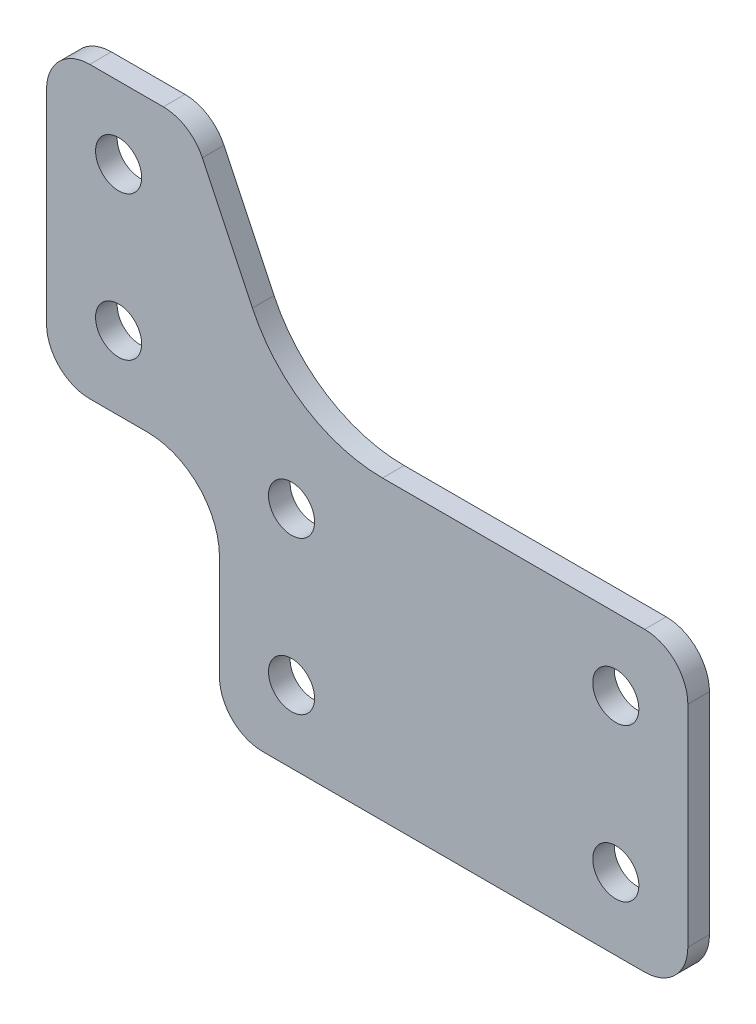
ISO-10303-21;
HEADER;
FILE_DESCRIPTION(('STEP AP214'),'2;1');
FILE_NAME('part.step','',(''),(''),'','','');
FILE_SCHEMA(('AUTOMOTIVE_DESIGN { 1 0 10303 214 1 1 1 1 }'));
ENDSEC;
DATA;
#1=APPLICATION_CONTEXT('core data for automotive mechanical design processes');
#2=APPLICATION_PROTOCOL_DEFINITION('international standard','automotive_design',2000,#1);
#3=PRODUCT_CONTEXT('',#1,'mechanical');
#4=PRODUCT('Part','Part','',(#3));
#5=PRODUCT_RELATED_PRODUCT_CATEGORY('part','',(#4));
#6=PRODUCT_DEFINITION_FORMATION('','',#4);
#7=PRODUCT_DEFINITION_CONTEXT('part definition',#1,'design');
#8=PRODUCT_DEFINITION('design','',#6,#7);
#9=PRODUCT_DEFINITION_SHAPE('','',#8);
#10=(LENGTH_UNIT() NAMED_UNIT(*) SI_UNIT(.MILLI.,.METRE.));
#11=(NAMED_UNIT(*) PLANE_ANGLE_UNIT() SI_UNIT($,.RADIAN.));
#12=(NAMED_UNIT(*) SI_UNIT($,.STERADIAN.) SOLID_ANGLE_UNIT());
#13=UNCERTAINTY_MEASURE_WITH_UNIT(LENGTH_MEASURE(1.E-05),#10,'distance_accuracy_value','');
#14=(GEOMETRIC_REPRESENTATION_CONTEXT(3) GLOBAL_UNCERTAINTY_ASSIGNED_CONTEXT((#13)) GLOBAL_UNIT_ASSIGNED_CONTEXT((#10,
#11,#12)) REPRESENTATION_CONTEXT('',''));
#15=CARTESIAN_POINT('',(0.,0.,0.));
#16=DIRECTION('',(0.,0.,1.));
#17=DIRECTION('',(1.,0.,0.));
#18=AXIS2_PLACEMENT_3D('',#15,#16,#17);
#19=CARTESIAN_POINT('',(0.,4.90000000000024,1.5));
#20=DIRECTION('',(0.,1.,0.));
#21=DIRECTION('',(-1.,0.,0.));
#22=AXIS2_PLACEMENT_3D('',#19,#20,#21);
#23=PLANE('',#22);
#24=DIRECTION('',(1.,0.,0.));
#25=VECTOR('',#24,1.);
#26=CARTESIAN_POINT('',(0.,4.90000000000024,0.));
#27=LINE('',#26,#25);
#28=CARTESIAN_POINT('',(-25.25,4.89999999999998,0.));
#29=VERTEX_POINT('',#28);
#30=CARTESIAN_POINT('',(-21.25,4.90000000000002,0.));
#31=VERTEX_POINT('',#30);
#32=EDGE_CURVE('E306',#29,#31,#27,.T.);
#33=ORIENTED_EDGE('',*,*,#32,.T.);
#34=DIRECTION('',(0.,0.,-1.));
#35=VECTOR('',#34,1.);
#36=CARTESIAN_POINT('',(-21.25,4.90000000000002,1.5));
#37=LINE('',#36,#35);
#38=CARTESIAN_POINT('',(-21.25,4.90000000000002,1.5));
#39=VERTEX_POINT('',#38);
#40=EDGE_CURVE('E253',#31,#39,#37,.F.);
#41=ORIENTED_EDGE('',*,*,#40,.T.);
#42=DIRECTION('',(1.,0.,0.));
#43=VECTOR('',#42,1.);
#44=CARTESIAN_POINT('',(0.,4.90000000000024,1.5));
#45=LINE('',#44,#43);
#46=CARTESIAN_POINT('',(-25.25,4.89999999999998,1.5));
#47=VERTEX_POINT('',#46);
#48=EDGE_CURVE('E201',#47,#39,#45,.T.);
#49=ORIENTED_EDGE('',*,*,#48,.F.);
#50=DIRECTION('',(0.,0.,-1.));
#51=VECTOR('',#50,1.);
#52=CARTESIAN_POINT('',(-25.25,4.89999999999998,1.5));
#53=LINE('',#52,#51);
#54=EDGE_CURVE('E226',#47,#29,#53,.T.);
#55=ORIENTED_EDGE('',*,*,#54,.T.);
#56=EDGE_LOOP('',(#33,#41,#49,#55));
#57=FACE_BOUND('',#56,.T.);
#58=ADVANCED_FACE('F37',(#57),#23,.F.);
#59=CARTESIAN_POINT('',(-16.25,0.,1.5));
#60=DIRECTION('',(1.,0.,0.));
#61=DIRECTION('',(0.,0.,-1.));
#62=AXIS2_PLACEMENT_3D('',#59,#60,#61);
#63=PLANE('',#62);
#64=DIRECTION('',(0.,-1.,0.));
#65=VECTOR('',#64,1.);
#66=CARTESIAN_POINT('',(-16.25,0.,1.5));
#67=LINE('',#66,#65);
#68=CARTESIAN_POINT('',(-16.25,-0.0999999999999785,1.5));
#69=VERTEX_POINT('',#68);
#70=CARTESIAN_POINT('',(-16.25,-7.3,1.5));
#71=VERTEX_POINT('',#70);
#72=EDGE_CURVE('E367',#69,#71,#67,.T.);
#73=ORIENTED_EDGE('',*,*,#72,.F.);
#74=DIRECTION('',(0.,0.,-1.));
#75=VECTOR('',#74,1.);
#76=CARTESIAN_POINT('',(-16.25,-0.0999999999999785,0.));
#77=LINE('',#76,#75);
#78=CARTESIAN_POINT('',(-16.25,-0.0999999999999785,0.));
#79=VERTEX_POINT('',#78);
#80=EDGE_CURVE('E250',#69,#79,#77,.T.);
#81=ORIENTED_EDGE('',*,*,#80,.T.);
#82=DIRECTION('',(0.,-1.,0.));
#83=VECTOR('',#82,1.);
#84=CARTESIAN_POINT('',(-16.25,0.,0.));
#85=LINE('',#84,#83);
#86=CARTESIAN_POINT('',(-16.25,-7.3,0.));
#87=VERTEX_POINT('',#86);
#88=EDGE_CURVE('E309',#79,#87,#85,.T.);
#89=ORIENTED_EDGE('',*,*,#88,.T.);
#90=DIRECTION('',(0.,0.,-1.));
#91=VECTOR('',#90,1.);
#92=CARTESIAN_POINT('',(-16.25,-7.3,1.5));
#93=LINE('',#92,#91);
#94=EDGE_CURVE('E239',#87,#71,#93,.F.);
#95=ORIENTED_EDGE('',*,*,#94,.T.);
#96=EDGE_LOOP('',(#73,#81,#89,#95));
#97=FACE_BOUND('',#96,.T.);
#98=ADVANCED_FACE('F339',(#97),#63,.F.);
#99=CARTESIAN_POINT('',(0.,-10.3,1.5));
#100=DIRECTION('',(0.,-1.,0.));
#101=DIRECTION('',(0.,0.,-1.));
#102=AXIS2_PLACEMENT_3D('',#99,#100,#101);
#103=PLANE('',#102);
#104=DIRECTION('',(-1.,0.,0.));
#105=VECTOR('',#104,1.);
#106=CARTESIAN_POINT('',(0.,-10.3,1.5));
#107=LINE('',#106,#105);
#108=CARTESIAN_POINT('',(13.25,-10.3,1.5));
#109=VERTEX_POINT('',#108);
#110=CARTESIAN_POINT('',(-13.25,-10.3,1.5));
#111=VERTEX_POINT('',#110);
#112=EDGE_CURVE('E281',#109,#111,#107,.T.);
#113=ORIENTED_EDGE('',*,*,#112,.T.);
#114=DIRECTION('',(0.,0.,-1.));
#115=VECTOR('',#114,1.);
#116=CARTESIAN_POINT('',(-13.25,-10.3,0.));
#117=LINE('',#116,#115);
#118=CARTESIAN_POINT('',(-13.25,-10.3,0.));
#119=VERTEX_POINT('',#118);
#120=EDGE_CURVE('E236',#111,#119,#117,.T.);
#121=ORIENTED_EDGE('',*,*,#120,.T.);
#122=DIRECTION('',(-1.,0.,0.));
#123=VECTOR('',#122,1.);
#124=CARTESIAN_POINT('',(0.,-10.3,0.));
#125=LINE('',#124,#123);
#126=CARTESIAN_POINT('',(13.25,-10.3,0.));
#127=VERTEX_POINT('',#126);
#128=EDGE_CURVE('E311',#127,#119,#125,.T.);
#129=ORIENTED_EDGE('',*,*,#128,.F.);
#130=DIRECTION('',(0.,0.,-1.));
#131=VECTOR('',#130,1.);
#132=CARTESIAN_POINT('',(13.25,-10.3,1.5));
#133=LINE('',#132,#131);
#134=EDGE_CURVE('E234',#127,#109,#133,.F.);
#135=ORIENTED_EDGE('',*,*,#134,.T.);
#136=EDGE_LOOP('',(#113,#121,#129,#135));
#137=FACE_BOUND('',#136,.T.);
#138=ADVANCED_FACE('F345',(#137),#103,.T.);
#139=CARTESIAN_POINT('',(16.25,0.,1.5));
#140=DIRECTION('',(1.,0.,0.));
#141=DIRECTION('',(0.,0.,-1.));
#142=AXIS2_PLACEMENT_3D('',#139,#140,#141);
#143=PLANE('',#142);
#144=DIRECTION('',(0.,-1.,0.));
#145=VECTOR('',#144,1.);
#146=CARTESIAN_POINT('',(16.25,0.,1.5));
#147=LINE('',#146,#145);
#148=CARTESIAN_POINT('',(16.25,7.3,1.5));
#149=VERTEX_POINT('',#148);
#150=CARTESIAN_POINT('',(16.25,-7.3,1.5));
#151=VERTEX_POINT('',#150);
#152=EDGE_CURVE('E277',#149,#151,#147,.T.);
#153=ORIENTED_EDGE('',*,*,#152,.T.);
#154=DIRECTION('',(0.,0.,-1.));
#155=VECTOR('',#154,1.);
#156=CARTESIAN_POINT('',(16.25,-7.3,1.5));
#157=LINE('',#156,#155);
#158=CARTESIAN_POINT('',(16.25,-7.3,0.));
#159=VERTEX_POINT('',#158);
#160=EDGE_CURVE('E244',#151,#159,#157,.T.);
#161=ORIENTED_EDGE('',*,*,#160,.T.);
#162=DIRECTION('',(0.,-1.,0.));
#163=VECTOR('',#162,1.);
#164=CARTESIAN_POINT('',(16.25,0.,0.));
#165=LINE('',#164,#163);
#166=CARTESIAN_POINT('',(16.25,7.3,0.));
#167=VERTEX_POINT('',#166);
#168=EDGE_CURVE('E314',#167,#159,#165,.T.);
#169=ORIENTED_EDGE('',*,*,#168,.F.);
#170=DIRECTION('',(0.,0.,-1.));
#171=VECTOR('',#170,1.);
#172=CARTESIAN_POINT('',(16.25,7.3,1.5));
#173=LINE('',#172,#171);
#174=EDGE_CURVE('E242',#167,#149,#173,.F.);
#175=ORIENTED_EDGE('',*,*,#174,.T.);
#176=EDGE_LOOP('',(#153,#161,#169,#175));
#177=FACE_BOUND('',#176,.T.);
#178=ADVANCED_FACE('F321',(#177),#143,.T.);
#179=CARTESIAN_POINT('',(0.,10.3,1.5));
#180=DIRECTION('',(0.,-1.,0.));
#181=DIRECTION('',(0.,0.,-1.));
#182=AXIS2_PLACEMENT_3D('',#179,#180,#181);
#183=PLANE('',#182);
#184=DIRECTION('',(-1.,0.,0.));
#185=VECTOR('',#184,1.);
#186=CARTESIAN_POINT('',(0.,10.3,0.));
#187=LINE('',#186,#185);
#188=CARTESIAN_POINT('',(13.25,10.3,0.));
#189=VERTEX_POINT('',#188);
#190=CARTESIAN_POINT('',(-4.93599680989238,10.3,0.));
#191=VERTEX_POINT('',#190);
#192=EDGE_CURVE('E180',#189,#191,#187,.T.);
#193=ORIENTED_EDGE('',*,*,#192,.T.);
#194=DIRECTION('',(0.,0.,-1.));
#195=VECTOR('',#194,1.);
#196=CARTESIAN_POINT('',(-4.93599680989238,10.3,1.5));
#197=LINE('',#196,#195);
#198=CARTESIAN_POINT('',(-4.93599680989238,10.3,1.5));
#199=VERTEX_POINT('',#198);
#200=EDGE_CURVE('E58',#191,#199,#197,.F.);
#201=ORIENTED_EDGE('',*,*,#200,.T.);
#202=DIRECTION('',(-1.,0.,0.));
#203=VECTOR('',#202,1.);
#204=CARTESIAN_POINT('',(0.,10.3,1.5));
#205=LINE('',#204,#203);
#206=CARTESIAN_POINT('',(13.25,10.3,1.5));
#207=VERTEX_POINT('',#206);
#208=EDGE_CURVE('E273',#207,#199,#205,.T.);
#209=ORIENTED_EDGE('',*,*,#208,.F.);
#210=DIRECTION('',(0.,0.,-1.));
#211=VECTOR('',#210,1.);
#212=CARTESIAN_POINT('',(13.25,10.3,0.));
#213=LINE('',#212,#211);
#214=EDGE_CURVE('E247',#207,#189,#213,.T.);
#215=ORIENTED_EDGE('',*,*,#214,.T.);
#216=EDGE_LOOP('',(#193,#201,#209,#215));
#217=FACE_BOUND('',#216,.T.);
#218=ADVANCED_FACE('F316',(#217),#183,.F.);
#219=CARTESIAN_POINT('',(-5.1723659889094,-2.4630314232902,1.5));
#220=DIRECTION('',(0.90286051882393,0.429933580392349,0.));
#221=DIRECTION('',(-0.429933580392349,0.90286051882393,0.));
#222=AXIS2_PLACEMENT_3D('',#219,#220,#221);
#223=PLANE('',#222);
#224=DIRECTION('',(0.429933580392349,-0.90286051882393,0.));
#225=VECTOR('',#224,1.);
#226=CARTESIAN_POINT('',(-5.1723659889094,-2.4630314232902,1.5));
#227=LINE('',#226,#225);
#228=CARTESIAN_POINT('',(-17.4356194005605,23.2898007411771,1.5));
#229=VERTEX_POINT('',#228);
#230=CARTESIAN_POINT('',(-13.9646019981317,16.0006641960765,1.5));
#231=VERTEX_POINT('',#230);
#232=EDGE_CURVE('E267',#229,#231,#227,.T.);
#233=ORIENTED_EDGE('',*,*,#232,.T.);
#234=DIRECTION('',(0.,0.,-1.));
#235=VECTOR('',#234,1.);
#236=CARTESIAN_POINT('',(-13.9646019981317,16.0006641960765,1.5));
#237=LINE('',#236,#235);
#238=CARTESIAN_POINT('',(-13.9646019981317,16.0006641960765,0.));
#239=VERTEX_POINT('',#238);
#240=EDGE_CURVE('E259',#231,#239,#237,.T.);
#241=ORIENTED_EDGE('',*,*,#240,.T.);
#242=DIRECTION('',(0.429933580392349,-0.90286051882393,0.));
#243=VECTOR('',#242,1.);
#244=CARTESIAN_POINT('',(-5.1723659889094,-2.4630314232902,0.));
#245=LINE('',#244,#243);
#246=CARTESIAN_POINT('',(-17.4356194005605,23.2898007411771,0.));
#247=VERTEX_POINT('',#246);
#248=EDGE_CURVE('E175',#247,#239,#245,.T.);
#249=ORIENTED_EDGE('',*,*,#248,.F.);
#250=DIRECTION('',(0.,0.,-1.));
#251=VECTOR('',#250,1.);
#252=CARTESIAN_POINT('',(-17.4356194005605,23.2898007411771,1.5));
#253=LINE('',#252,#251);
#254=EDGE_CURVE('E155',#247,#229,#253,.F.);
#255=ORIENTED_EDGE('',*,*,#254,.T.);
#256=EDGE_LOOP('',(#233,#241,#249,#255));
#257=FACE_BOUND('',#256,.T.);
#258=ADVANCED_FACE('F265',(#257),#223,.T.);
#259=CARTESIAN_POINT('',(0.,25.,1.5));
#260=DIRECTION('',(0.,-1.,0.));
#261=DIRECTION('',(0.,0.,-1.));
#262=AXIS2_PLACEMENT_3D('',#259,#260,#261);
#263=PLANE('',#262);
#264=DIRECTION('',(-1.,0.,0.));
#265=VECTOR('',#264,1.);
#266=CARTESIAN_POINT('',(0.,25.,1.5));
#267=LINE('',#266,#265);
#268=CARTESIAN_POINT('',(-20.1442009570323,25.,1.5));
#269=VERTEX_POINT('',#268);
#270=CARTESIAN_POINT('',(-25.25,25.,1.5));
#271=VERTEX_POINT('',#270);
#272=EDGE_CURVE('E167',#269,#271,#267,.T.);
#273=ORIENTED_EDGE('',*,*,#272,.F.);
#274=DIRECTION('',(0.,0.,-1.));
#275=VECTOR('',#274,1.);
#276=CARTESIAN_POINT('',(-20.1442009570323,25.,0.));
#277=LINE('',#276,#275);
#278=CARTESIAN_POINT('',(-20.1442009570323,25.,0.));
#279=VERTEX_POINT('',#278);
#280=EDGE_CURVE('E154',#269,#279,#277,.T.);
#281=ORIENTED_EDGE('',*,*,#280,.T.);
#282=DIRECTION('',(-1.,0.,0.));
#283=VECTOR('',#282,1.);
#284=CARTESIAN_POINT('',(0.,25.,0.));
#285=LINE('',#284,#283);
#286=CARTESIAN_POINT('',(-25.25,25.,0.));
#287=VERTEX_POINT('',#286);
#288=EDGE_CURVE('E164',#279,#287,#285,.T.);
#289=ORIENTED_EDGE('',*,*,#288,.T.);
#290=DIRECTION('',(0.,0.,-1.));
#291=VECTOR('',#290,1.);
#292=CARTESIAN_POINT('',(-25.25,25.,1.5));
#293=LINE('',#292,#291);
#294=EDGE_CURVE('E169',#287,#271,#293,.F.);
#295=ORIENTED_EDGE('',*,*,#294,.T.);
#296=EDGE_LOOP('',(#273,#281,#289,#295));
#297=FACE_BOUND('',#296,.T.);
#298=ADVANCED_FACE('F163',(#297),#263,.F.);
#299=CARTESIAN_POINT('',(-11.25,5.3,1.5));
#300=DIRECTION('',(0.,0.,-1.));
#301=DIRECTION('',(-1.,0.,0.));
#302=AXIS2_PLACEMENT_3D('',#299,#300,#301);
#303=CYLINDRICAL_SURFACE('',#302,1.6);
#304=CARTESIAN_POINT('',(-11.25,5.3,1.5));
#305=DIRECTION('',(0.,0.,1.));
#306=DIRECTION('',(1.,0.,0.));
#307=AXIS2_PLACEMENT_3D('',#304,#305,#306);
#308=CIRCLE('',#307,1.6);
#309=CARTESIAN_POINT('',(-9.64999999999999,5.3,1.5));
#310=VERTEX_POINT('',#309);
#311=EDGE_CURVE('E301',#310,#310,#308,.T.);
#312=ORIENTED_EDGE('',*,*,#311,.T.);
#313=EDGE_LOOP('',(#312));
#314=FACE_BOUND('',#313,.T.);
#315=CARTESIAN_POINT('',(-11.25,5.3,0.));
#316=DIRECTION('',(0.,0.,1.));
#317=DIRECTION('',(1.,0.,0.));
#318=AXIS2_PLACEMENT_3D('',#315,#316,#317);
#319=CIRCLE('',#318,1.6);
#320=CARTESIAN_POINT('',(-9.64999999999999,5.3,0.));
#321=VERTEX_POINT('',#320);
#322=EDGE_CURVE('E195',#321,#321,#319,.T.);
#323=ORIENTED_EDGE('',*,*,#322,.F.);
#324=EDGE_LOOP('',(#323));
#325=FACE_BOUND('',#324,.T.);
#326=ADVANCED_FACE('F406',(#314,#325),#303,.F.);
#327=CARTESIAN_POINT('',(-11.25,-5.3,1.5));
#328=DIRECTION('',(0.,0.,-1.));
#329=DIRECTION('',(-1.,0.,0.));
#330=AXIS2_PLACEMENT_3D('',#327,#328,#329);
#331=CYLINDRICAL_SURFACE('',#330,1.6);
#332=CARTESIAN_POINT('',(-11.25,-5.3,1.5));
#333=DIRECTION('',(0.,0.,1.));
#334=DIRECTION('',(1.,0.,0.));
#335=AXIS2_PLACEMENT_3D('',#332,#333,#334);
#336=CIRCLE('',#335,1.6);
#337=CARTESIAN_POINT('',(-9.64999999999999,-5.3,1.5));
#338=VERTEX_POINT('',#337);
#339=EDGE_CURVE('E298',#338,#338,#336,.T.);
#340=ORIENTED_EDGE('',*,*,#339,.T.);
#341=EDGE_LOOP('',(#340));
#342=FACE_BOUND('',#341,.T.);
#343=CARTESIAN_POINT('',(-11.25,-5.3,0.));
#344=DIRECTION('',(0.,0.,1.));
#345=DIRECTION('',(1.,0.,0.));
#346=AXIS2_PLACEMENT_3D('',#343,#344,#345);
#347=CIRCLE('',#346,1.6);
#348=CARTESIAN_POINT('',(-9.64999999999999,-5.3,0.));
#349=VERTEX_POINT('',#348);
#350=EDGE_CURVE('E192',#349,#349,#347,.T.);
#351=ORIENTED_EDGE('',*,*,#350,.F.);
#352=EDGE_LOOP('',(#351));
#353=FACE_BOUND('',#352,.T.);
#354=ADVANCED_FACE('F442',(#342,#353),#331,.F.);
#355=CARTESIAN_POINT('',(11.25,-5.3,1.5));
#356=DIRECTION('',(0.,0.,-1.));
#357=DIRECTION('',(-1.,0.,0.));
#358=AXIS2_PLACEMENT_3D('',#355,#356,#357);
#359=CYLINDRICAL_SURFACE('',#358,1.6);
#360=CARTESIAN_POINT('',(11.25,-5.3,1.5));
#361=DIRECTION('',(0.,0.,1.));
#362=DIRECTION('',(1.,0.,0.));
#363=AXIS2_PLACEMENT_3D('',#360,#361,#362);
#364=CIRCLE('',#363,1.6);
#365=CARTESIAN_POINT('',(12.85,-5.3,1.5));
#366=VERTEX_POINT('',#365);
#367=EDGE_CURVE('E295',#366,#366,#364,.F.);
#368=ORIENTED_EDGE('',*,*,#367,.F.);
#369=EDGE_LOOP('',(#368));
#370=FACE_BOUND('',#369,.T.);
#371=CARTESIAN_POINT('',(11.25,-5.3,0.));
#372=DIRECTION('',(0.,0.,1.));
#373=DIRECTION('',(1.,0.,0.));
#374=AXIS2_PLACEMENT_3D('',#371,#372,#373);
#375=CIRCLE('',#374,1.6);
#376=CARTESIAN_POINT('',(12.85,-5.3,0.));
#377=VERTEX_POINT('',#376);
#378=EDGE_CURVE('E189',#377,#377,#375,.F.);
#379=ORIENTED_EDGE('',*,*,#378,.T.);
#380=EDGE_LOOP('',(#379));
#381=FACE_BOUND('',#380,.T.);
#382=ADVANCED_FACE('F450',(#370,#381),#359,.F.);
#383=CARTESIAN_POINT('',(-23.25,20.,1.5));
#384=DIRECTION('',(0.,0.,-1.));
#385=DIRECTION('',(-1.,0.,0.));
#386=AXIS2_PLACEMENT_3D('',#383,#384,#385);
#387=CYLINDRICAL_SURFACE('',#386,1.6);
#388=CARTESIAN_POINT('',(-23.25,20.,1.5));
#389=DIRECTION('',(0.,0.,1.));
#390=DIRECTION('',(1.,0.,0.));
#391=AXIS2_PLACEMENT_3D('',#388,#389,#390);
#392=CIRCLE('',#391,1.6);
#393=CARTESIAN_POINT('',(-21.65,20.,1.5));
#394=VERTEX_POINT('',#393);
#395=EDGE_CURVE('E292',#394,#394,#392,.T.);
#396=ORIENTED_EDGE('',*,*,#395,.T.);
#397=EDGE_LOOP('',(#396));
#398=FACE_BOUND('',#397,.T.);
#399=CARTESIAN_POINT('',(-23.25,20.,0.));
#400=DIRECTION('',(0.,0.,1.));
#401=DIRECTION('',(1.,0.,0.));
#402=AXIS2_PLACEMENT_3D('',#399,#400,#401);
#403=CIRCLE('',#402,1.6);
#404=CARTESIAN_POINT('',(-21.65,20.,0.));
#405=VERTEX_POINT('',#404);
#406=EDGE_CURVE('E186',#405,#405,#403,.T.);
#407=ORIENTED_EDGE('',*,*,#406,.F.);
#408=EDGE_LOOP('',(#407));
#409=FACE_BOUND('',#408,.T.);
#410=ADVANCED_FACE('F399',(#398,#409),#387,.F.);
#411=CARTESIAN_POINT('',(-23.25,10.,1.5));
#412=DIRECTION('',(0.,0.,-1.));
#413=DIRECTION('',(-1.,0.,0.));
#414=AXIS2_PLACEMENT_3D('',#411,#412,#413);
#415=CYLINDRICAL_SURFACE('',#414,1.6);
#416=CARTESIAN_POINT('',(-23.25,10.,1.5));
#417=DIRECTION('',(0.,0.,1.));
#418=DIRECTION('',(1.,0.,0.));
#419=AXIS2_PLACEMENT_3D('',#416,#417,#418);
#420=CIRCLE('',#419,1.6);
#421=CARTESIAN_POINT('',(-21.65,10.,1.5));
#422=VERTEX_POINT('',#421);
#423=EDGE_CURVE('E289',#422,#422,#420,.T.);
#424=ORIENTED_EDGE('',*,*,#423,.T.);
#425=EDGE_LOOP('',(#424));
#426=FACE_BOUND('',#425,.T.);
#427=CARTESIAN_POINT('',(-23.25,10.,0.));
#428=DIRECTION('',(0.,0.,1.));
#429=DIRECTION('',(1.,0.,0.));
#430=AXIS2_PLACEMENT_3D('',#427,#428,#429);
#431=CIRCLE('',#430,1.6);
#432=CARTESIAN_POINT('',(-21.65,10.,0.));
#433=VERTEX_POINT('',#432);
#434=EDGE_CURVE('E178',#433,#433,#431,.T.);
#435=ORIENTED_EDGE('',*,*,#434,.F.);
#436=EDGE_LOOP('',(#435));
#437=FACE_BOUND('',#436,.T.);
#438=ADVANCED_FACE('F391',(#426,#437),#415,.F.);
#439=CARTESIAN_POINT('',(-28.25,0.,1.5));
#440=DIRECTION('',(1.,0.,0.));
#441=DIRECTION('',(0.,0.,-1.));
#442=AXIS2_PLACEMENT_3D('',#439,#440,#441);
#443=PLANE('',#442);
#444=DIRECTION('',(0.,-1.,0.));
#445=VECTOR('',#444,1.);
#446=CARTESIAN_POINT('',(-28.25,0.,0.));
#447=LINE('',#446,#445);
#448=CARTESIAN_POINT('',(-28.25,22.,0.));
#449=VERTEX_POINT('',#448);
#450=CARTESIAN_POINT('',(-28.25,7.89999999999998,0.));
#451=VERTEX_POINT('',#450);
#452=EDGE_CURVE('E174',#449,#451,#447,.T.);
#453=ORIENTED_EDGE('',*,*,#452,.T.);
#454=DIRECTION('',(0.,0.,-1.));
#455=VECTOR('',#454,1.);
#456=CARTESIAN_POINT('',(-28.25,7.89999999999998,1.5));
#457=LINE('',#456,#455);
#458=CARTESIAN_POINT('',(-28.25,7.89999999999998,1.5));
#459=VERTEX_POINT('',#458);
#460=EDGE_CURVE('E232',#451,#459,#457,.F.);
#461=ORIENTED_EDGE('',*,*,#460,.T.);
#462=DIRECTION('',(0.,-1.,0.));
#463=VECTOR('',#462,1.);
#464=CARTESIAN_POINT('',(-28.25,0.,1.5));
#465=LINE('',#464,#463);
#466=CARTESIAN_POINT('',(-28.25,22.,1.5));
#467=VERTEX_POINT('',#466);
#468=EDGE_CURVE('E286',#467,#459,#465,.T.);
#469=ORIENTED_EDGE('',*,*,#468,.F.);
#470=DIRECTION('',(0.,0.,-1.));
#471=VECTOR('',#470,1.);
#472=CARTESIAN_POINT('',(-28.25,22.,1.5));
#473=LINE('',#472,#471);
#474=EDGE_CURVE('E229',#467,#449,#473,.T.);
#475=ORIENTED_EDGE('',*,*,#474,.T.);
#476=EDGE_LOOP('',(#453,#461,#469,#475));
#477=FACE_BOUND('',#476,.T.);
#478=ADVANCED_FACE('F385',(#477),#443,.F.);
#479=CARTESIAN_POINT('',(11.25,5.3,1.5));
#480=DIRECTION('',(0.,0.,-1.));
#481=DIRECTION('',(-1.,0.,0.));
#482=AXIS2_PLACEMENT_3D('',#479,#480,#481);
#483=CYLINDRICAL_SURFACE('',#482,1.59999999999999);
#484=CARTESIAN_POINT('',(11.25,5.3,1.5));
#485=DIRECTION('',(0.,0.,1.));
#486=DIRECTION('',(1.,0.,0.));
#487=AXIS2_PLACEMENT_3D('',#484,#485,#486);
#488=CIRCLE('',#487,1.59999999999999);
#489=CARTESIAN_POINT('',(12.85,5.3,1.5));
#490=VERTEX_POINT('',#489);
#491=EDGE_CURVE('E202',#490,#490,#488,.F.);
#492=ORIENTED_EDGE('',*,*,#491,.F.);
#493=EDGE_LOOP('',(#492));
#494=FACE_BOUND('',#493,.T.);
#495=CARTESIAN_POINT('',(11.25,5.3,0.));
#496=DIRECTION('',(0.,0.,1.));
#497=DIRECTION('',(1.,0.,0.));
#498=AXIS2_PLACEMENT_3D('',#495,#496,#497);
#499=CIRCLE('',#498,1.59999999999999);
#500=CARTESIAN_POINT('',(12.85,5.3,0.));
#501=VERTEX_POINT('',#500);
#502=EDGE_CURVE('E198',#501,#501,#499,.F.);
#503=ORIENTED_EDGE('',*,*,#502,.T.);
#504=EDGE_LOOP('',(#503));
#505=FACE_BOUND('',#504,.T.);
#506=ADVANCED_FACE('F390',(#494,#505),#483,.F.);
#507=CARTESIAN_POINT('',(0.,0.,1.5));
#508=DIRECTION('',(0.,0.,1.));
#509=DIRECTION('',(1.,0.,0.));
#510=AXIS2_PLACEMENT_3D('',#507,#508,#509);
#511=PLANE('',#510);
#512=ORIENTED_EDGE('',*,*,#232,.F.);
#513=CARTESIAN_POINT('',(-20.1442009570323,22.,1.5));
#514=DIRECTION('',(0.,0.,1.));
#515=DIRECTION('',(1.,0.,0.));
#516=AXIS2_PLACEMENT_3D('',#513,#514,#515);
#517=CIRCLE('',#516,3.);
#518=EDGE_CURVE('E224',#229,#269,#517,.T.);
#519=ORIENTED_EDGE('',*,*,#518,.T.);
#520=ORIENTED_EDGE('',*,*,#272,.T.);
#521=CARTESIAN_POINT('',(-25.25,22.,1.5));
#522=DIRECTION('',(0.,0.,1.));
#523=DIRECTION('',(1.,0.,0.));
#524=AXIS2_PLACEMENT_3D('',#521,#522,#523);
#525=CIRCLE('',#524,3.);
#526=EDGE_CURVE('E214',#271,#467,#525,.T.);
#527=ORIENTED_EDGE('',*,*,#526,.T.);
#528=ORIENTED_EDGE('',*,*,#468,.T.);
#529=CARTESIAN_POINT('',(-25.25,7.89999999999998,1.5));
#530=DIRECTION('',(0.,0.,1.));
#531=DIRECTION('',(1.,0.,0.));
#532=AXIS2_PLACEMENT_3D('',#529,#530,#531);
#533=CIRCLE('',#532,3.);
#534=EDGE_CURVE('E222',#459,#47,#533,.T.);
#535=ORIENTED_EDGE('',*,*,#534,.T.);
#536=ORIENTED_EDGE('',*,*,#48,.T.);
#537=CARTESIAN_POINT('',(-21.25,-0.0999999999999785,1.5));
#538=DIRECTION('',(0.,0.,1.));
#539=DIRECTION('',(1.,0.,0.));
#540=AXIS2_PLACEMENT_3D('',#537,#538,#539);
#541=CIRCLE('',#540,5.);
#542=EDGE_CURVE('E257',#39,#69,#541,.F.);
#543=ORIENTED_EDGE('',*,*,#542,.T.);
#544=ORIENTED_EDGE('',*,*,#72,.T.);
#545=CARTESIAN_POINT('',(-13.25,-7.3,1.5));
#546=DIRECTION('',(0.,0.,1.));
#547=DIRECTION('',(1.,0.,0.));
#548=AXIS2_PLACEMENT_3D('',#545,#546,#547);
#549=CIRCLE('',#548,3.);
#550=EDGE_CURVE('E220',#71,#111,#549,.T.);
#551=ORIENTED_EDGE('',*,*,#550,.T.);
#552=ORIENTED_EDGE('',*,*,#112,.F.);
#553=CARTESIAN_POINT('',(13.25,-7.3,1.5));
#554=DIRECTION('',(0.,0.,1.));
#555=DIRECTION('',(1.,0.,0.));
#556=AXIS2_PLACEMENT_3D('',#553,#554,#555);
#557=CIRCLE('',#556,3.);
#558=EDGE_CURVE('E218',#109,#151,#557,.T.);
#559=ORIENTED_EDGE('',*,*,#558,.T.);
#560=ORIENTED_EDGE('',*,*,#152,.F.);
#561=CARTESIAN_POINT('',(13.25,7.3,1.5));
#562=DIRECTION('',(0.,0.,1.));
#563=DIRECTION('',(1.,0.,0.));
#564=AXIS2_PLACEMENT_3D('',#561,#562,#563);
#565=CIRCLE('',#564,3.);
#566=EDGE_CURVE('E216',#149,#207,#565,.T.);
#567=ORIENTED_EDGE('',*,*,#566,.T.);
#568=ORIENTED_EDGE('',*,*,#208,.T.);
#569=CARTESIAN_POINT('',(-4.93599680989238,20.3,1.5));
#570=DIRECTION('',(0.,0.,1.));
#571=DIRECTION('',(1.,0.,0.));
#572=AXIS2_PLACEMENT_3D('',#569,#570,#571);
#573=CIRCLE('',#572,10.);
#574=EDGE_CURVE('E11',#199,#231,#573,.F.);
#575=ORIENTED_EDGE('',*,*,#574,.T.);
#576=EDGE_LOOP('',(#512,#519,#520,#527,#528,#535,#536,#543,#544,#551,#552,#559,#560,#567,#568,#575));
#577=FACE_BOUND('',#576,.T.);
#578=ORIENTED_EDGE('',*,*,#423,.F.);
#579=EDGE_LOOP('',(#578));
#580=FACE_BOUND('',#579,.T.);
#581=ORIENTED_EDGE('',*,*,#395,.F.);
#582=EDGE_LOOP('',(#581));
#583=FACE_BOUND('',#582,.T.);
#584=ORIENTED_EDGE('',*,*,#367,.T.);
#585=EDGE_LOOP('',(#584));
#586=FACE_BOUND('',#585,.T.);
#587=ORIENTED_EDGE('',*,*,#339,.F.);
#588=EDGE_LOOP('',(#587));
#589=FACE_BOUND('',#588,.T.);
#590=ORIENTED_EDGE('',*,*,#311,.F.);
#591=EDGE_LOOP('',(#590));
#592=FACE_BOUND('',#591,.T.);
#593=ORIENTED_EDGE('',*,*,#491,.T.);
#594=EDGE_LOOP('',(#593));
#595=FACE_BOUND('',#594,.T.);
#596=ADVANCED_FACE('F271',(#577,#580,#583,#586,#589,#592,#595),#511,.T.);
#597=CARTESIAN_POINT('',(0.,0.,0.));
#598=DIRECTION('',(0.,0.,1.));
#599=DIRECTION('',(1.,0.,0.));
#600=AXIS2_PLACEMENT_3D('',#597,#598,#599);
#601=PLANE('',#600);
#602=ORIENTED_EDGE('',*,*,#288,.F.);
#603=CARTESIAN_POINT('',(-20.1442009570323,22.,0.));
#604=DIRECTION('',(0.,0.,1.));
#605=DIRECTION('',(1.,0.,0.));
#606=AXIS2_PLACEMENT_3D('',#603,#604,#605);
#607=CIRCLE('',#606,3.);
#608=EDGE_CURVE('E150',#279,#247,#607,.F.);
#609=ORIENTED_EDGE('',*,*,#608,.T.);
#610=ORIENTED_EDGE('',*,*,#248,.T.);
#611=CARTESIAN_POINT('',(-4.93599680989238,20.3,0.));
#612=DIRECTION('',(0.,0.,1.));
#613=DIRECTION('',(1.,0.,0.));
#614=AXIS2_PLACEMENT_3D('',#611,#612,#613);
#615=CIRCLE('',#614,10.);
#616=EDGE_CURVE('E45',#239,#191,#615,.T.);
#617=ORIENTED_EDGE('',*,*,#616,.T.);
#618=ORIENTED_EDGE('',*,*,#192,.F.);
#619=CARTESIAN_POINT('',(13.25,7.3,0.));
#620=DIRECTION('',(0.,0.,1.));
#621=DIRECTION('',(1.,0.,0.));
#622=AXIS2_PLACEMENT_3D('',#619,#620,#621);
#623=CIRCLE('',#622,3.);
#624=EDGE_CURVE('E205',#189,#167,#623,.F.);
#625=ORIENTED_EDGE('',*,*,#624,.T.);
#626=ORIENTED_EDGE('',*,*,#168,.T.);
#627=CARTESIAN_POINT('',(13.25,-7.3,0.));
#628=DIRECTION('',(0.,0.,1.));
#629=DIRECTION('',(1.,0.,0.));
#630=AXIS2_PLACEMENT_3D('',#627,#628,#629);
#631=CIRCLE('',#630,3.);
#632=EDGE_CURVE('E207',#159,#127,#631,.F.);
#633=ORIENTED_EDGE('',*,*,#632,.T.);
#634=ORIENTED_EDGE('',*,*,#128,.T.);
#635=CARTESIAN_POINT('',(-13.25,-7.3,0.));
#636=DIRECTION('',(0.,0.,1.));
#637=DIRECTION('',(1.,0.,0.));
#638=AXIS2_PLACEMENT_3D('',#635,#636,#637);
#639=CIRCLE('',#638,3.);
#640=EDGE_CURVE('E209',#119,#87,#639,.F.);
#641=ORIENTED_EDGE('',*,*,#640,.T.);
#642=ORIENTED_EDGE('',*,*,#88,.F.);
#643=CARTESIAN_POINT('',(-21.25,-0.0999999999999785,0.));
#644=DIRECTION('',(0.,0.,1.));
#645=DIRECTION('',(1.,0.,0.));
#646=AXIS2_PLACEMENT_3D('',#643,#644,#645);
#647=CIRCLE('',#646,5.);
#648=EDGE_CURVE('E255',#79,#31,#647,.T.);
#649=ORIENTED_EDGE('',*,*,#648,.T.);
#650=ORIENTED_EDGE('',*,*,#32,.F.);
#651=CARTESIAN_POINT('',(-25.25,7.89999999999998,0.));
#652=DIRECTION('',(0.,0.,1.));
#653=DIRECTION('',(1.,0.,0.));
#654=AXIS2_PLACEMENT_3D('',#651,#652,#653);
#655=CIRCLE('',#654,3.);
#656=EDGE_CURVE('E158',#29,#451,#655,.F.);
#657=ORIENTED_EDGE('',*,*,#656,.T.);
#658=ORIENTED_EDGE('',*,*,#452,.F.);
#659=CARTESIAN_POINT('',(-25.25,22.,0.));
#660=DIRECTION('',(0.,0.,1.));
#661=DIRECTION('',(1.,0.,0.));
#662=AXIS2_PLACEMENT_3D('',#659,#660,#661);
#663=CIRCLE('',#662,3.);
#664=EDGE_CURVE('E168',#449,#287,#663,.F.);
#665=ORIENTED_EDGE('',*,*,#664,.T.);
#666=EDGE_LOOP('',(#602,#609,#610,#617,#618,#625,#626,#633,#634,#641,#642,#649,#650,#657,#658,#665));
#667=FACE_BOUND('',#666,.T.);
#668=ORIENTED_EDGE('',*,*,#434,.T.);
#669=EDGE_LOOP('',(#668));
#670=FACE_BOUND('',#669,.T.);
#671=ORIENTED_EDGE('',*,*,#406,.T.);
#672=EDGE_LOOP('',(#671));
#673=FACE_BOUND('',#672,.T.);
#674=ORIENTED_EDGE('',*,*,#378,.F.);
#675=EDGE_LOOP('',(#674));
#676=FACE_BOUND('',#675,.T.);
#677=ORIENTED_EDGE('',*,*,#350,.T.);
#678=EDGE_LOOP('',(#677));
#679=FACE_BOUND('',#678,.T.);
#680=ORIENTED_EDGE('',*,*,#322,.T.);
#681=EDGE_LOOP('',(#680));
#682=FACE_BOUND('',#681,.T.);
#683=ORIENTED_EDGE('',*,*,#502,.F.);
#684=EDGE_LOOP('',(#683));
#685=FACE_BOUND('',#684,.T.);
#686=ADVANCED_FACE('F171',(#667,#670,#673,#676,#679,#682,#685),#601,.F.);
#687=CARTESIAN_POINT('',(-20.1442009570323,22.,1.5));
#688=DIRECTION('',(0.,0.,1.));
#689=DIRECTION('',(1.,0.,0.));
#690=AXIS2_PLACEMENT_3D('',#687,#688,#689);
#691=CYLINDRICAL_SURFACE('',#690,3.);
#692=ORIENTED_EDGE('',*,*,#518,.F.);
#693=ORIENTED_EDGE('',*,*,#254,.F.);
#694=ORIENTED_EDGE('',*,*,#608,.F.);
#695=ORIENTED_EDGE('',*,*,#280,.F.);
#696=EDGE_LOOP('',(#692,#693,#694,#695));
#697=FACE_BOUND('',#696,.T.);
#698=ADVANCED_FACE('F153',(#697),#691,.T.);
#699=CARTESIAN_POINT('',(-25.25,7.89999999999998,1.5));
#700=DIRECTION('',(0.,0.,-1.));
#701=DIRECTION('',(-1.,0.,0.));
#702=AXIS2_PLACEMENT_3D('',#699,#700,#701);
#703=CYLINDRICAL_SURFACE('',#702,3.);
#704=ORIENTED_EDGE('',*,*,#534,.F.);
#705=ORIENTED_EDGE('',*,*,#460,.F.);
#706=ORIENTED_EDGE('',*,*,#656,.F.);
#707=ORIENTED_EDGE('',*,*,#54,.F.);
#708=EDGE_LOOP('',(#704,#705,#706,#707));
#709=FACE_BOUND('',#708,.T.);
#710=ADVANCED_FACE('F352',(#709),#703,.T.);
#711=CARTESIAN_POINT('',(-13.25,-7.3,1.5));
#712=DIRECTION('',(0.,0.,1.));
#713=DIRECTION('',(1.,0.,0.));
#714=AXIS2_PLACEMENT_3D('',#711,#712,#713);
#715=CYLINDRICAL_SURFACE('',#714,3.);
#716=ORIENTED_EDGE('',*,*,#550,.F.);
#717=ORIENTED_EDGE('',*,*,#94,.F.);
#718=ORIENTED_EDGE('',*,*,#640,.F.);
#719=ORIENTED_EDGE('',*,*,#120,.F.);
#720=EDGE_LOOP('',(#716,#717,#718,#719));
#721=FACE_BOUND('',#720,.T.);
#722=ADVANCED_FACE('F335',(#721),#715,.T.);
#723=CARTESIAN_POINT('',(13.25,-7.3,1.5));
#724=DIRECTION('',(0.,0.,-1.));
#725=DIRECTION('',(-1.,0.,0.));
#726=AXIS2_PLACEMENT_3D('',#723,#724,#725);
#727=CYLINDRICAL_SURFACE('',#726,3.);
#728=ORIENTED_EDGE('',*,*,#558,.F.);
#729=ORIENTED_EDGE('',*,*,#134,.F.);
#730=ORIENTED_EDGE('',*,*,#632,.F.);
#731=ORIENTED_EDGE('',*,*,#160,.F.);
#732=EDGE_LOOP('',(#728,#729,#730,#731));
#733=FACE_BOUND('',#732,.T.);
#734=ADVANCED_FACE('F326',(#733),#727,.T.);
#735=CARTESIAN_POINT('',(13.25,7.3,1.5));
#736=DIRECTION('',(0.,0.,1.));
#737=DIRECTION('',(1.,0.,0.));
#738=AXIS2_PLACEMENT_3D('',#735,#736,#737);
#739=CYLINDRICAL_SURFACE('',#738,3.);
#740=ORIENTED_EDGE('',*,*,#566,.F.);
#741=ORIENTED_EDGE('',*,*,#174,.F.);
#742=ORIENTED_EDGE('',*,*,#624,.F.);
#743=ORIENTED_EDGE('',*,*,#214,.F.);
#744=EDGE_LOOP('',(#740,#741,#742,#743));
#745=FACE_BOUND('',#744,.T.);
#746=ADVANCED_FACE('F323',(#745),#739,.T.);
#747=CARTESIAN_POINT('',(-25.25,22.,1.5));
#748=DIRECTION('',(0.,0.,-1.));
#749=DIRECTION('',(-1.,0.,0.));
#750=AXIS2_PLACEMENT_3D('',#747,#748,#749);
#751=CYLINDRICAL_SURFACE('',#750,3.);
#752=ORIENTED_EDGE('',*,*,#526,.F.);
#753=ORIENTED_EDGE('',*,*,#294,.F.);
#754=ORIENTED_EDGE('',*,*,#664,.F.);
#755=ORIENTED_EDGE('',*,*,#474,.F.);
#756=EDGE_LOOP('',(#752,#753,#754,#755));
#757=FACE_BOUND('',#756,.T.);
#758=ADVANCED_FACE('F325',(#757),#751,.T.);
#759=CARTESIAN_POINT('',(-21.25,-0.0999999999999785,1.5));
#760=DIRECTION('',(0.,0.,1.));
#761=DIRECTION('',(1.,0.,0.));
#762=AXIS2_PLACEMENT_3D('',#759,#760,#761);
#763=CYLINDRICAL_SURFACE('',#762,5.);
#764=ORIENTED_EDGE('',*,*,#542,.F.);
#765=ORIENTED_EDGE('',*,*,#40,.F.);
#766=ORIENTED_EDGE('',*,*,#648,.F.);
#767=ORIENTED_EDGE('',*,*,#80,.F.);
#768=EDGE_LOOP('',(#764,#765,#766,#767));
#769=FACE_BOUND('',#768,.T.);
#770=ADVANCED_FACE('F332',(#769),#763,.F.);
#771=CARTESIAN_POINT('',(-4.93599680989238,20.3,1.5));
#772=DIRECTION('',(0.,0.,-1.));
#773=DIRECTION('',(-1.,0.,0.));
#774=AXIS2_PLACEMENT_3D('',#771,#772,#773);
#775=CYLINDRICAL_SURFACE('',#774,10.);
#776=ORIENTED_EDGE('',*,*,#574,.F.);
#777=ORIENTED_EDGE('',*,*,#200,.F.);
#778=ORIENTED_EDGE('',*,*,#616,.F.);
#779=ORIENTED_EDGE('',*,*,#240,.F.);
#780=EDGE_LOOP('',(#776,#777,#778,#779));
#781=FACE_BOUND('',#780,.T.);
#782=ADVANCED_FACE('F39',(#781),#775,.F.);
#783=CLOSED_SHELL('',(#58,#98,#138,#178,#218,#258,#298,#326,#354,#382,#410,#438,#478,#506,#596,
#686,#698,#710,#722,#734,#746,#758,#770,#782));
#784=MANIFOLD_SOLID_BREP('B2',#783);
#785=ADVANCED_BREP_SHAPE_REPRESENTATION('',(#18,#784),#14);
#786=SHAPE_DEFINITION_REPRESENTATION(#9,#785);
ENDSEC;
END-ISO-10303-21;
